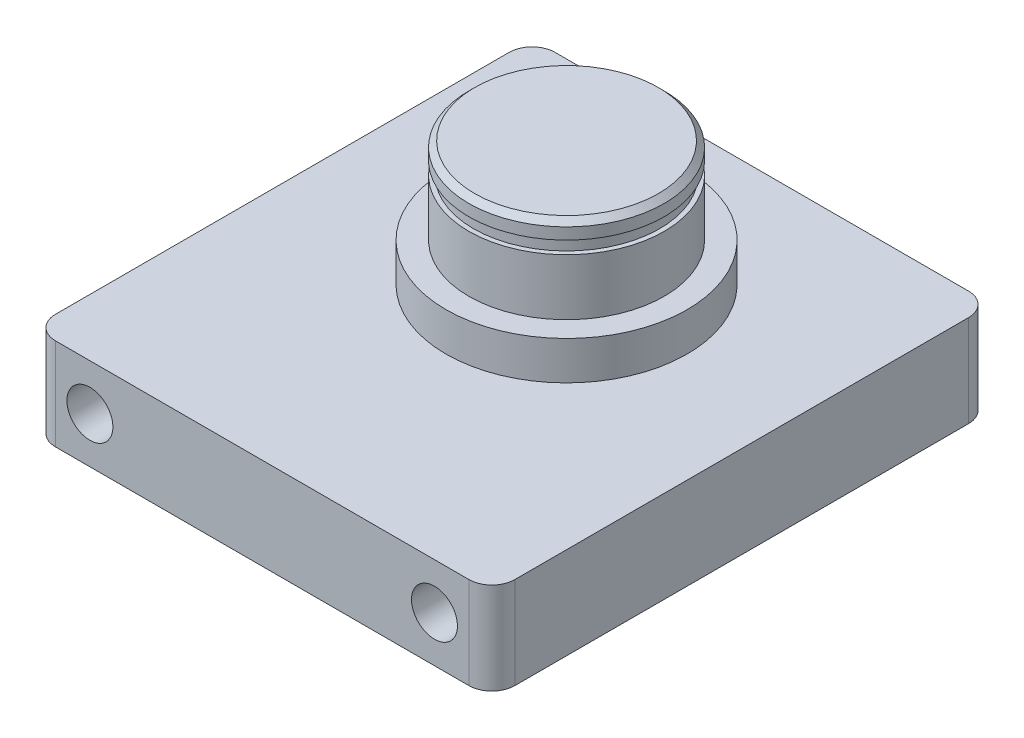
ISO-10303-21;
HEADER;
FILE_DESCRIPTION(('STEP AP214'),'2;1');
FILE_NAME('part.step','',(''),(''),'','','');
FILE_SCHEMA(('AUTOMOTIVE_DESIGN { 1 0 10303 214 1 1 1 1 }'));
ENDSEC;
DATA;
#1=APPLICATION_CONTEXT('core data for automotive mechanical design processes');
#2=APPLICATION_PROTOCOL_DEFINITION('international standard','automotive_design',2000,#1);
#3=PRODUCT_CONTEXT('',#1,'mechanical');
#4=PRODUCT('Part','Part','',(#3));
#5=PRODUCT_RELATED_PRODUCT_CATEGORY('part','',(#4));
#6=PRODUCT_DEFINITION_FORMATION('','',#4);
#7=PRODUCT_DEFINITION_CONTEXT('part definition',#1,'design');
#8=PRODUCT_DEFINITION('design','',#6,#7);
#9=PRODUCT_DEFINITION_SHAPE('','',#8);
#10=(LENGTH_UNIT() NAMED_UNIT(*) SI_UNIT(.MILLI.,.METRE.));
#11=(NAMED_UNIT(*) PLANE_ANGLE_UNIT() SI_UNIT($,.RADIAN.));
#12=(NAMED_UNIT(*) SI_UNIT($,.STERADIAN.) SOLID_ANGLE_UNIT());
#13=UNCERTAINTY_MEASURE_WITH_UNIT(LENGTH_MEASURE(1.E-05),#10,'distance_accuracy_value','');
#14=(GEOMETRIC_REPRESENTATION_CONTEXT(3) GLOBAL_UNCERTAINTY_ASSIGNED_CONTEXT((#13)) GLOBAL_UNIT_ASSIGNED_CONTEXT((#10,
#11,#12)) REPRESENTATION_CONTEXT('',''));
#15=CARTESIAN_POINT('',(0.,0.,0.));
#16=DIRECTION('',(0.,0.,1.));
#17=DIRECTION('',(1.,0.,0.));
#18=AXIS2_PLACEMENT_3D('',#15,#16,#17);
#19=CARTESIAN_POINT('',(0.,18.85,0.));
#20=DIRECTION('',(0.,-1.,0.));
#21=DIRECTION('',(0.,0.,-1.));
#22=AXIS2_PLACEMENT_3D('',#19,#20,#21);
#23=CYLINDRICAL_SURFACE('',#22,8.5);
#24=CARTESIAN_POINT('',(0.,11.35,0.));
#25=DIRECTION('',(0.,1.,0.));
#26=DIRECTION('',(0.,0.,1.));
#27=AXIS2_PLACEMENT_3D('',#24,#25,#26);
#28=CIRCLE('',#27,8.5);
#29=CARTESIAN_POINT('',(0.,11.35,8.5));
#30=VERTEX_POINT('',#29);
#31=EDGE_CURVE('E162',#30,#30,#28,.T.);
#32=ORIENTED_EDGE('',*,*,#31,.T.);
#33=EDGE_LOOP('',(#32));
#34=FACE_BOUND('',#33,.T.);
#35=CARTESIAN_POINT('',(0.,16.25,0.));
#36=DIRECTION('',(0.,1.,0.));
#37=DIRECTION('',(0.,0.,1.));
#38=AXIS2_PLACEMENT_3D('',#35,#36,#37);
#39=CIRCLE('',#38,8.5);
#40=CARTESIAN_POINT('',(0.,16.25,8.5));
#41=VERTEX_POINT('',#40);
#42=EDGE_CURVE('E242',#41,#41,#39,.T.);
#43=ORIENTED_EDGE('',*,*,#42,.F.);
#44=EDGE_LOOP('',(#43));
#45=FACE_BOUND('',#44,.T.);
#46=ADVANCED_FACE('F44',(#34,#45),#23,.T.);
#47=CARTESIAN_POINT('',(20.,8.,26.5));
#48=DIRECTION('',(-1.,0.,0.));
#49=DIRECTION('',(0.,0.,1.));
#50=AXIS2_PLACEMENT_3D('',#47,#48,#49);
#51=PLANE('',#50);
#52=DIRECTION('',(0.,0.,-1.));
#53=VECTOR('',#52,1.);
#54=CARTESIAN_POINT('',(20.,0.,26.5));
#55=LINE('',#54,#53);
#56=CARTESIAN_POINT('',(20.,0.,24.5));
#57=VERTEX_POINT('',#56);
#58=CARTESIAN_POINT('',(20.,0.,-15.));
#59=VERTEX_POINT('',#58);
#60=EDGE_CURVE('E141',#57,#59,#55,.T.);
#61=ORIENTED_EDGE('',*,*,#60,.T.);
#62=DIRECTION('',(0.,-1.,0.));
#63=VECTOR('',#62,1.);
#64=CARTESIAN_POINT('',(20.,8.,-15.));
#65=LINE('',#64,#63);
#66=CARTESIAN_POINT('',(20.,8.,-15.));
#67=VERTEX_POINT('',#66);
#68=EDGE_CURVE('E116',#59,#67,#65,.F.);
#69=ORIENTED_EDGE('',*,*,#68,.T.);
#70=DIRECTION('',(0.,0.,-1.));
#71=VECTOR('',#70,1.);
#72=CARTESIAN_POINT('',(20.,8.,26.5));
#73=LINE('',#72,#71);
#74=CARTESIAN_POINT('',(20.,8.,24.5));
#75=VERTEX_POINT('',#74);
#76=EDGE_CURVE('E156',#75,#67,#73,.T.);
#77=ORIENTED_EDGE('',*,*,#76,.F.);
#78=DIRECTION('',(0.,-1.,0.));
#79=VECTOR('',#78,1.);
#80=CARTESIAN_POINT('',(20.,8.,24.5));
#81=LINE('',#80,#79);
#82=EDGE_CURVE('E122',#75,#57,#81,.T.);
#83=ORIENTED_EDGE('',*,*,#82,.T.);
#84=EDGE_LOOP('',(#61,#69,#77,#83));
#85=FACE_BOUND('',#84,.T.);
#86=ADVANCED_FACE('F283',(#85),#51,.F.);
#87=CARTESIAN_POINT('',(-20.,8.,-17.));
#88=DIRECTION('',(0.,0.,1.));
#89=DIRECTION('',(1.,0.,0.));
#90=AXIS2_PLACEMENT_3D('',#87,#88,#89);
#91=PLANE('',#90);
#92=CARTESIAN_POINT('',(15.,4.,-17.));
#93=DIRECTION('',(0.,0.,-1.));
#94=DIRECTION('',(-1.,0.,0.));
#95=AXIS2_PLACEMENT_3D('',#92,#93,#94);
#96=CIRCLE('',#95,2.);
#97=CARTESIAN_POINT('',(13.,4.,-17.));
#98=VERTEX_POINT('',#97);
#99=EDGE_CURVE('E246',#98,#98,#96,.T.);
#100=ORIENTED_EDGE('',*,*,#99,.F.);
#101=EDGE_LOOP('',(#100));
#102=FACE_BOUND('',#101,.T.);
#103=CARTESIAN_POINT('',(-15.,4.,-17.));
#104=DIRECTION('',(0.,0.,-1.));
#105=DIRECTION('',(-1.,0.,0.));
#106=AXIS2_PLACEMENT_3D('',#103,#104,#105);
#107=CIRCLE('',#106,2.);
#108=CARTESIAN_POINT('',(-17.,4.,-17.));
#109=VERTEX_POINT('',#108);
#110=EDGE_CURVE('E237',#109,#109,#107,.T.);
#111=ORIENTED_EDGE('',*,*,#110,.F.);
#112=EDGE_LOOP('',(#111));
#113=FACE_BOUND('',#112,.T.);
#114=DIRECTION('',(-1.,0.,0.));
#115=VECTOR('',#114,1.);
#116=CARTESIAN_POINT('',(-20.,8.,-17.));
#117=LINE('',#116,#115);
#118=CARTESIAN_POINT('',(18.,8.,-17.));
#119=VERTEX_POINT('',#118);
#120=CARTESIAN_POINT('',(-18.,8.,-17.));
#121=VERTEX_POINT('',#120);
#122=EDGE_CURVE('E132',#119,#121,#117,.T.);
#123=ORIENTED_EDGE('',*,*,#122,.F.);
#124=DIRECTION('',(0.,-1.,0.));
#125=VECTOR('',#124,1.);
#126=CARTESIAN_POINT('',(18.,8.,-17.));
#127=LINE('',#126,#125);
#128=CARTESIAN_POINT('',(18.,0.,-17.));
#129=VERTEX_POINT('',#128);
#130=EDGE_CURVE('E115',#119,#129,#127,.T.);
#131=ORIENTED_EDGE('',*,*,#130,.T.);
#132=DIRECTION('',(-1.,0.,0.));
#133=VECTOR('',#132,1.);
#134=CARTESIAN_POINT('',(-20.,0.,-17.));
#135=LINE('',#134,#133);
#136=CARTESIAN_POINT('',(-18.,0.,-17.));
#137=VERTEX_POINT('',#136);
#138=EDGE_CURVE('E129',#129,#137,#135,.T.);
#139=ORIENTED_EDGE('',*,*,#138,.T.);
#140=DIRECTION('',(0.,-1.,0.));
#141=VECTOR('',#140,1.);
#142=CARTESIAN_POINT('',(-18.,8.,-17.));
#143=LINE('',#142,#141);
#144=EDGE_CURVE('E135',#137,#121,#143,.F.);
#145=ORIENTED_EDGE('',*,*,#144,.T.);
#146=EDGE_LOOP('',(#123,#131,#139,#145));
#147=FACE_BOUND('',#146,.T.);
#148=ADVANCED_FACE('F128',(#102,#113,#147),#91,.F.);
#149=CARTESIAN_POINT('',(-20.,8.,26.5));
#150=DIRECTION('',(1.,0.,0.));
#151=DIRECTION('',(0.,0.,-1.));
#152=AXIS2_PLACEMENT_3D('',#149,#150,#151);
#153=PLANE('',#152);
#154=DIRECTION('',(0.,0.,1.));
#155=VECTOR('',#154,1.);
#156=CARTESIAN_POINT('',(-20.,0.,26.5));
#157=LINE('',#156,#155);
#158=CARTESIAN_POINT('',(-20.,0.,-15.));
#159=VERTEX_POINT('',#158);
#160=CARTESIAN_POINT('',(-20.,0.,24.5));
#161=VERTEX_POINT('',#160);
#162=EDGE_CURVE('E140',#159,#161,#157,.T.);
#163=ORIENTED_EDGE('',*,*,#162,.T.);
#164=DIRECTION('',(0.,-1.,0.));
#165=VECTOR('',#164,1.);
#166=CARTESIAN_POINT('',(-20.,8.,24.5));
#167=LINE('',#166,#165);
#168=CARTESIAN_POINT('',(-20.,8.,24.5));
#169=VERTEX_POINT('',#168);
#170=EDGE_CURVE('E11',#161,#169,#167,.F.);
#171=ORIENTED_EDGE('',*,*,#170,.T.);
#172=DIRECTION('',(0.,0.,1.));
#173=VECTOR('',#172,1.);
#174=CARTESIAN_POINT('',(-20.,8.,26.5));
#175=LINE('',#174,#173);
#176=CARTESIAN_POINT('',(-20.,8.,-15.));
#177=VERTEX_POINT('',#176);
#178=EDGE_CURVE('E205',#177,#169,#175,.T.);
#179=ORIENTED_EDGE('',*,*,#178,.F.);
#180=DIRECTION('',(0.,-1.,0.));
#181=VECTOR('',#180,1.);
#182=CARTESIAN_POINT('',(-20.,8.,-15.));
#183=LINE('',#182,#181);
#184=EDGE_CURVE('E53',#177,#159,#183,.T.);
#185=ORIENTED_EDGE('',*,*,#184,.T.);
#186=EDGE_LOOP('',(#163,#171,#179,#185));
#187=FACE_BOUND('',#186,.T.);
#188=ADVANCED_FACE('F203',(#187),#153,.F.);
#189=CARTESIAN_POINT('',(-20.,8.,26.5));
#190=DIRECTION('',(0.,0.,-1.));
#191=DIRECTION('',(-1.,0.,0.));
#192=AXIS2_PLACEMENT_3D('',#189,#190,#191);
#193=PLANE('',#192);
#194=CARTESIAN_POINT('',(15.,4.,26.5));
#195=DIRECTION('',(0.,0.,-1.));
#196=DIRECTION('',(-1.,0.,0.));
#197=AXIS2_PLACEMENT_3D('',#194,#195,#196);
#198=CIRCLE('',#197,2.);
#199=CARTESIAN_POINT('',(13.,4.,26.5));
#200=VERTEX_POINT('',#199);
#201=EDGE_CURVE('E233',#200,#200,#198,.T.);
#202=ORIENTED_EDGE('',*,*,#201,.T.);
#203=EDGE_LOOP('',(#202));
#204=FACE_BOUND('',#203,.T.);
#205=CARTESIAN_POINT('',(-15.,4.,26.5));
#206=DIRECTION('',(0.,0.,-1.));
#207=DIRECTION('',(-1.,0.,0.));
#208=AXIS2_PLACEMENT_3D('',#205,#206,#207);
#209=CIRCLE('',#208,2.);
#210=CARTESIAN_POINT('',(-17.,4.,26.5));
#211=VERTEX_POINT('',#210);
#212=EDGE_CURVE('E241',#211,#211,#209,.T.);
#213=ORIENTED_EDGE('',*,*,#212,.T.);
#214=EDGE_LOOP('',(#213));
#215=FACE_BOUND('',#214,.T.);
#216=DIRECTION('',(1.,0.,0.));
#217=VECTOR('',#216,1.);
#218=CARTESIAN_POINT('',(-20.,0.,26.5));
#219=LINE('',#218,#217);
#220=CARTESIAN_POINT('',(-18.,0.,26.5));
#221=VERTEX_POINT('',#220);
#222=CARTESIAN_POINT('',(18.,0.,26.5));
#223=VERTEX_POINT('',#222);
#224=EDGE_CURVE('E148',#221,#223,#219,.T.);
#225=ORIENTED_EDGE('',*,*,#224,.T.);
#226=DIRECTION('',(0.,-1.,0.));
#227=VECTOR('',#226,1.);
#228=CARTESIAN_POINT('',(18.,8.,26.5));
#229=LINE('',#228,#227);
#230=CARTESIAN_POINT('',(18.,8.,26.5));
#231=VERTEX_POINT('',#230);
#232=EDGE_CURVE('E60',#223,#231,#229,.F.);
#233=ORIENTED_EDGE('',*,*,#232,.T.);
#234=DIRECTION('',(1.,0.,0.));
#235=VECTOR('',#234,1.);
#236=CARTESIAN_POINT('',(-20.,8.,26.5));
#237=LINE('',#236,#235);
#238=CARTESIAN_POINT('',(-18.,8.,26.5));
#239=VERTEX_POINT('',#238);
#240=EDGE_CURVE('E213',#239,#231,#237,.T.);
#241=ORIENTED_EDGE('',*,*,#240,.F.);
#242=DIRECTION('',(0.,-1.,0.));
#243=VECTOR('',#242,1.);
#244=CARTESIAN_POINT('',(-18.,8.,26.5));
#245=LINE('',#244,#243);
#246=EDGE_CURVE('E191',#239,#221,#245,.T.);
#247=ORIENTED_EDGE('',*,*,#246,.T.);
#248=EDGE_LOOP('',(#225,#233,#241,#247));
#249=FACE_BOUND('',#248,.T.);
#250=ADVANCED_FACE('F212',(#204,#215,#249),#193,.F.);
#251=CARTESIAN_POINT('',(0.,8.,0.));
#252=DIRECTION('',(0.,-1.,0.));
#253=DIRECTION('',(0.,0.,-1.));
#254=AXIS2_PLACEMENT_3D('',#251,#252,#253);
#255=PLANE('',#254);
#256=CARTESIAN_POINT('',(0.,8.,0.));
#257=DIRECTION('',(0.,1.,0.));
#258=DIRECTION('',(0.,0.,1.));
#259=AXIS2_PLACEMENT_3D('',#256,#257,#258);
#260=CIRCLE('',#259,10.5);
#261=CARTESIAN_POINT('',(0.,8.,10.5));
#262=VERTEX_POINT('',#261);
#263=EDGE_CURVE('E216',#262,#262,#260,.T.);
#264=ORIENTED_EDGE('',*,*,#263,.F.);
#265=EDGE_LOOP('',(#264));
#266=FACE_BOUND('',#265,.T.);
#267=ORIENTED_EDGE('',*,*,#76,.T.);
#268=CARTESIAN_POINT('',(18.,8.,-15.));
#269=DIRECTION('',(0.,-1.,0.));
#270=DIRECTION('',(0.,0.,-1.));
#271=AXIS2_PLACEMENT_3D('',#268,#269,#270);
#272=CIRCLE('',#271,2.);
#273=EDGE_CURVE('E188',#67,#119,#272,.F.);
#274=ORIENTED_EDGE('',*,*,#273,.T.);
#275=ORIENTED_EDGE('',*,*,#122,.T.);
#276=CARTESIAN_POINT('',(-18.,8.,-15.));
#277=DIRECTION('',(0.,-1.,0.));
#278=DIRECTION('',(0.,0.,-1.));
#279=AXIS2_PLACEMENT_3D('',#276,#277,#278);
#280=CIRCLE('',#279,2.);
#281=EDGE_CURVE('E180',#121,#177,#280,.F.);
#282=ORIENTED_EDGE('',*,*,#281,.T.);
#283=ORIENTED_EDGE('',*,*,#178,.T.);
#284=CARTESIAN_POINT('',(-18.,8.,24.5));
#285=DIRECTION('',(0.,-1.,0.));
#286=DIRECTION('',(0.,0.,-1.));
#287=AXIS2_PLACEMENT_3D('',#284,#285,#286);
#288=CIRCLE('',#287,2.);
#289=EDGE_CURVE('E67',#169,#239,#288,.F.);
#290=ORIENTED_EDGE('',*,*,#289,.T.);
#291=ORIENTED_EDGE('',*,*,#240,.T.);
#292=CARTESIAN_POINT('',(18.,8.,24.5));
#293=DIRECTION('',(0.,-1.,0.));
#294=DIRECTION('',(0.,0.,-1.));
#295=AXIS2_PLACEMENT_3D('',#292,#293,#294);
#296=CIRCLE('',#295,2.);
#297=EDGE_CURVE('E185',#231,#75,#296,.F.);
#298=ORIENTED_EDGE('',*,*,#297,.T.);
#299=EDGE_LOOP('',(#267,#274,#275,#282,#283,#290,#291,#298));
#300=FACE_BOUND('',#299,.T.);
#301=ADVANCED_FACE('F357',(#266,#300),#255,.F.);
#302=CARTESIAN_POINT('',(0.,0.,0.));
#303=DIRECTION('',(0.,-1.,0.));
#304=DIRECTION('',(0.,0.,-1.));
#305=AXIS2_PLACEMENT_3D('',#302,#303,#304);
#306=PLANE('',#305);
#307=ORIENTED_EDGE('',*,*,#138,.F.);
#308=CARTESIAN_POINT('',(18.,0.,-15.));
#309=DIRECTION('',(0.,-1.,0.));
#310=DIRECTION('',(0.,0.,-1.));
#311=AXIS2_PLACEMENT_3D('',#308,#309,#310);
#312=CIRCLE('',#311,2.);
#313=EDGE_CURVE('E111',#129,#59,#312,.T.);
#314=ORIENTED_EDGE('',*,*,#313,.T.);
#315=ORIENTED_EDGE('',*,*,#60,.F.);
#316=CARTESIAN_POINT('',(18.,0.,24.5));
#317=DIRECTION('',(0.,-1.,0.));
#318=DIRECTION('',(0.,0.,-1.));
#319=AXIS2_PLACEMENT_3D('',#316,#317,#318);
#320=CIRCLE('',#319,2.);
#321=EDGE_CURVE('E123',#57,#223,#320,.T.);
#322=ORIENTED_EDGE('',*,*,#321,.T.);
#323=ORIENTED_EDGE('',*,*,#224,.F.);
#324=CARTESIAN_POINT('',(-18.,0.,24.5));
#325=DIRECTION('',(0.,-1.,0.));
#326=DIRECTION('',(0.,0.,-1.));
#327=AXIS2_PLACEMENT_3D('',#324,#325,#326);
#328=CIRCLE('',#327,2.);
#329=EDGE_CURVE('E170',#221,#161,#328,.T.);
#330=ORIENTED_EDGE('',*,*,#329,.T.);
#331=ORIENTED_EDGE('',*,*,#162,.F.);
#332=CARTESIAN_POINT('',(-18.,0.,-15.));
#333=DIRECTION('',(0.,-1.,0.));
#334=DIRECTION('',(0.,0.,-1.));
#335=AXIS2_PLACEMENT_3D('',#332,#333,#334);
#336=CIRCLE('',#335,2.);
#337=EDGE_CURVE('E134',#159,#137,#336,.T.);
#338=ORIENTED_EDGE('',*,*,#337,.T.);
#339=EDGE_LOOP('',(#307,#314,#315,#322,#323,#330,#331,#338));
#340=FACE_BOUND('',#339,.T.);
#341=ADVANCED_FACE('F137',(#340),#306,.T.);
#342=CARTESIAN_POINT('',(0.,11.35,0.));
#343=DIRECTION('',(0.,-1.,0.));
#344=DIRECTION('',(0.,0.,-1.));
#345=AXIS2_PLACEMENT_3D('',#342,#343,#344);
#346=CYLINDRICAL_SURFACE('',#345,10.5);
#347=CARTESIAN_POINT('',(0.,11.35,0.));
#348=DIRECTION('',(0.,1.,0.));
#349=DIRECTION('',(0.,0.,1.));
#350=AXIS2_PLACEMENT_3D('',#347,#348,#349);
#351=CIRCLE('',#350,10.5);
#352=CARTESIAN_POINT('',(0.,11.35,10.5));
#353=VERTEX_POINT('',#352);
#354=EDGE_CURVE('E150',#353,#353,#351,.T.);
#355=ORIENTED_EDGE('',*,*,#354,.F.);
#356=EDGE_LOOP('',(#355));
#357=FACE_BOUND('',#356,.T.);
#358=ORIENTED_EDGE('',*,*,#263,.T.);
#359=EDGE_LOOP('',(#358));
#360=FACE_BOUND('',#359,.T.);
#361=ADVANCED_FACE('F327',(#357,#360),#346,.T.);
#362=CARTESIAN_POINT('',(0.,11.35,0.));
#363=DIRECTION('',(0.,1.,0.));
#364=DIRECTION('',(0.,0.,1.));
#365=AXIS2_PLACEMENT_3D('',#362,#363,#364);
#366=PLANE('',#365);
#367=ORIENTED_EDGE('',*,*,#31,.F.);
#368=EDGE_LOOP('',(#367));
#369=FACE_BOUND('',#368,.T.);
#370=ORIENTED_EDGE('',*,*,#354,.T.);
#371=EDGE_LOOP('',(#370));
#372=FACE_BOUND('',#371,.T.);
#373=ADVANCED_FACE('F322',(#369,#372),#366,.T.);
#374=CARTESIAN_POINT('',(-15.,4.,26.5));
#375=DIRECTION('',(0.,0.,-1.));
#376=DIRECTION('',(-1.,0.,0.));
#377=AXIS2_PLACEMENT_3D('',#374,#375,#376);
#378=CYLINDRICAL_SURFACE('',#377,2.);
#379=ORIENTED_EDGE('',*,*,#212,.F.);
#380=EDGE_LOOP('',(#379));
#381=FACE_BOUND('',#380,.T.);
#382=ORIENTED_EDGE('',*,*,#110,.T.);
#383=EDGE_LOOP('',(#382));
#384=FACE_BOUND('',#383,.T.);
#385=ADVANCED_FACE('F319',(#381,#384),#378,.F.);
#386=CARTESIAN_POINT('',(15.,4.,26.5));
#387=DIRECTION('',(0.,0.,-1.));
#388=DIRECTION('',(-1.,0.,0.));
#389=AXIS2_PLACEMENT_3D('',#386,#387,#388);
#390=CYLINDRICAL_SURFACE('',#389,2.);
#391=ORIENTED_EDGE('',*,*,#201,.F.);
#392=EDGE_LOOP('',(#391));
#393=FACE_BOUND('',#392,.T.);
#394=ORIENTED_EDGE('',*,*,#99,.T.);
#395=EDGE_LOOP('',(#394));
#396=FACE_BOUND('',#395,.T.);
#397=ADVANCED_FACE('F278',(#393,#396),#390,.F.);
#398=CARTESIAN_POINT('',(0.,16.25,0.));
#399=DIRECTION('',(0.,1.,0.));
#400=DIRECTION('',(0.,0.,1.));
#401=AXIS2_PLACEMENT_3D('',#398,#399,#400);
#402=PLANE('',#401);
#403=CARTESIAN_POINT('',(0.,16.25,0.));
#404=DIRECTION('',(0.,1.,0.));
#405=DIRECTION('',(0.,0.,1.));
#406=AXIS2_PLACEMENT_3D('',#403,#404,#405);
#407=CIRCLE('',#406,8.1);
#408=CARTESIAN_POINT('',(0.,16.25,8.1));
#409=VERTEX_POINT('',#408);
#410=EDGE_CURVE('E257',#409,#409,#407,.T.);
#411=ORIENTED_EDGE('',*,*,#410,.F.);
#412=EDGE_LOOP('',(#411));
#413=FACE_BOUND('',#412,.T.);
#414=ORIENTED_EDGE('',*,*,#42,.T.);
#415=EDGE_LOOP('',(#414));
#416=FACE_BOUND('',#415,.T.);
#417=ADVANCED_FACE('F274',(#413,#416),#402,.T.);
#418=CARTESIAN_POINT('',(0.,17.35,0.));
#419=DIRECTION('',(0.,1.,0.));
#420=DIRECTION('',(0.,0.,1.));
#421=AXIS2_PLACEMENT_3D('',#418,#419,#420);
#422=PLANE('',#421);
#423=CARTESIAN_POINT('',(0.,17.35,0.));
#424=DIRECTION('',(0.,1.,0.));
#425=DIRECTION('',(0.,0.,1.));
#426=AXIS2_PLACEMENT_3D('',#423,#424,#425);
#427=CIRCLE('',#426,8.1);
#428=CARTESIAN_POINT('',(0.,17.35,8.1));
#429=VERTEX_POINT('',#428);
#430=EDGE_CURVE('E261',#429,#429,#427,.T.);
#431=ORIENTED_EDGE('',*,*,#430,.T.);
#432=EDGE_LOOP('',(#431));
#433=FACE_BOUND('',#432,.T.);
#434=CARTESIAN_POINT('',(0.,17.35,0.));
#435=DIRECTION('',(0.,1.,0.));
#436=DIRECTION('',(0.,0.,1.));
#437=AXIS2_PLACEMENT_3D('',#434,#435,#436);
#438=CIRCLE('',#437,8.5);
#439=CARTESIAN_POINT('',(0.,17.35,8.5));
#440=VERTEX_POINT('',#439);
#441=EDGE_CURVE('E253',#440,#440,#438,.T.);
#442=ORIENTED_EDGE('',*,*,#441,.F.);
#443=EDGE_LOOP('',(#442));
#444=FACE_BOUND('',#443,.T.);
#445=ADVANCED_FACE('F277',(#433,#444),#422,.F.);
#446=CARTESIAN_POINT('',(0.,16.25,0.));
#447=DIRECTION('',(0.,1.,0.));
#448=DIRECTION('',(0.,0.,1.));
#449=AXIS2_PLACEMENT_3D('',#446,#447,#448);
#450=CYLINDRICAL_SURFACE('',#449,8.1);
#451=ORIENTED_EDGE('',*,*,#410,.T.);
#452=EDGE_LOOP('',(#451));
#453=FACE_BOUND('',#452,.T.);
#454=ORIENTED_EDGE('',*,*,#430,.F.);
#455=EDGE_LOOP('',(#454));
#456=FACE_BOUND('',#455,.T.);
#457=ADVANCED_FACE('F271',(#453,#456),#450,.T.);
#458=CARTESIAN_POINT('',(0.,18.85,0.));
#459=DIRECTION('',(0.,1.,0.));
#460=DIRECTION('',(0.,0.,1.));
#461=AXIS2_PLACEMENT_3D('',#458,#459,#460);
#462=PLANE('',#461);
#463=CARTESIAN_POINT('',(0.,18.85,0.));
#464=DIRECTION('',(0.,1.,0.));
#465=DIRECTION('',(0.,0.,1.));
#466=AXIS2_PLACEMENT_3D('',#463,#464,#465);
#467=CIRCLE('',#466,7.99999999999999);
#468=CARTESIAN_POINT('',(0.,18.85,7.99999999999999));
#469=VERTEX_POINT('',#468);
#470=EDGE_CURVE('E157',#469,#469,#467,.T.);
#471=ORIENTED_EDGE('',*,*,#470,.T.);
#472=EDGE_LOOP('',(#471));
#473=FACE_BOUND('',#472,.T.);
#474=ADVANCED_FACE('F296',(#473),#462,.T.);
#475=CARTESIAN_POINT('',(0.,18.35,0.));
#476=DIRECTION('',(0.,1.,0.));
#477=DIRECTION('',(0.,0.,1.));
#478=AXIS2_PLACEMENT_3D('',#475,#476,#477);
#479=CIRCLE('',#478,8.5);
#480=CARTESIAN_POINT('',(0.,18.35,8.5));
#481=VERTEX_POINT('',#480);
#482=EDGE_CURVE('E161',#481,#481,#479,.F.);
#483=ORIENTED_EDGE('',*,*,#482,.T.);
#484=EDGE_LOOP('',(#483));
#485=FACE_BOUND('',#484,.T.);
#486=ORIENTED_EDGE('',*,*,#441,.T.);
#487=EDGE_LOOP('',(#486));
#488=FACE_BOUND('',#487,.T.);
#489=ADVANCED_FACE('F286',(#485,#488),#23,.T.);
#490=CARTESIAN_POINT('',(0.,18.85,0.));
#491=DIRECTION('',(0.,-1.,0.));
#492=DIRECTION('',(0.,0.,-1.));
#493=AXIS2_PLACEMENT_3D('',#490,#491,#492);
#494=CONICAL_SURFACE('',#493,7.99999999999999,0.785398163397448);
#495=ORIENTED_EDGE('',*,*,#482,.F.);
#496=EDGE_LOOP('',(#495));
#497=FACE_BOUND('',#496,.T.);
#498=ORIENTED_EDGE('',*,*,#470,.F.);
#499=EDGE_LOOP('',(#498));
#500=FACE_BOUND('',#499,.T.);
#501=ADVANCED_FACE('F295',(#497,#500),#494,.T.);
#502=CARTESIAN_POINT('',(18.,8.,-15.));
#503=DIRECTION('',(0.,-1.,0.));
#504=DIRECTION('',(0.,0.,-1.));
#505=AXIS2_PLACEMENT_3D('',#502,#503,#504);
#506=CYLINDRICAL_SURFACE('',#505,2.);
#507=ORIENTED_EDGE('',*,*,#273,.F.);
#508=ORIENTED_EDGE('',*,*,#68,.F.);
#509=ORIENTED_EDGE('',*,*,#313,.F.);
#510=ORIENTED_EDGE('',*,*,#130,.F.);
#511=EDGE_LOOP('',(#507,#508,#509,#510));
#512=FACE_BOUND('',#511,.T.);
#513=ADVANCED_FACE('F114',(#512),#506,.T.);
#514=CARTESIAN_POINT('',(18.,8.,24.5));
#515=DIRECTION('',(0.,-1.,0.));
#516=DIRECTION('',(0.,0.,-1.));
#517=AXIS2_PLACEMENT_3D('',#514,#515,#516);
#518=CYLINDRICAL_SURFACE('',#517,2.);
#519=ORIENTED_EDGE('',*,*,#297,.F.);
#520=ORIENTED_EDGE('',*,*,#232,.F.);
#521=ORIENTED_EDGE('',*,*,#321,.F.);
#522=ORIENTED_EDGE('',*,*,#82,.F.);
#523=EDGE_LOOP('',(#519,#520,#521,#522));
#524=FACE_BOUND('',#523,.T.);
#525=ADVANCED_FACE('F348',(#524),#518,.T.);
#526=CARTESIAN_POINT('',(-18.,8.,24.5));
#527=DIRECTION('',(0.,-1.,0.));
#528=DIRECTION('',(0.,0.,-1.));
#529=AXIS2_PLACEMENT_3D('',#526,#527,#528);
#530=CYLINDRICAL_SURFACE('',#529,2.);
#531=ORIENTED_EDGE('',*,*,#289,.F.);
#532=ORIENTED_EDGE('',*,*,#170,.F.);
#533=ORIENTED_EDGE('',*,*,#329,.F.);
#534=ORIENTED_EDGE('',*,*,#246,.F.);
#535=EDGE_LOOP('',(#531,#532,#533,#534));
#536=FACE_BOUND('',#535,.T.);
#537=ADVANCED_FACE('F211',(#536),#530,.T.);
#538=CARTESIAN_POINT('',(-18.,8.,-15.));
#539=DIRECTION('',(0.,-1.,0.));
#540=DIRECTION('',(0.,0.,-1.));
#541=AXIS2_PLACEMENT_3D('',#538,#539,#540);
#542=CYLINDRICAL_SURFACE('',#541,2.);
#543=ORIENTED_EDGE('',*,*,#281,.F.);
#544=ORIENTED_EDGE('',*,*,#144,.F.);
#545=ORIENTED_EDGE('',*,*,#337,.F.);
#546=ORIENTED_EDGE('',*,*,#184,.F.);
#547=EDGE_LOOP('',(#543,#544,#545,#546));
#548=FACE_BOUND('',#547,.T.);
#549=ADVANCED_FACE('F46',(#548),#542,.T.);
#550=CLOSED_SHELL('',(#46,#86,#148,#188,#250,#301,#341,#361,#373,#385,#397,#417,#445,#457,#474,
#489,#501,#513,#525,#537,#549));
#551=MANIFOLD_SOLID_BREP('B2',#550);
#552=ADVANCED_BREP_SHAPE_REPRESENTATION('',(#18,#551),#14);
#553=SHAPE_DEFINITION_REPRESENTATION(#9,#552);
ENDSEC;
END-ISO-10303-21;
